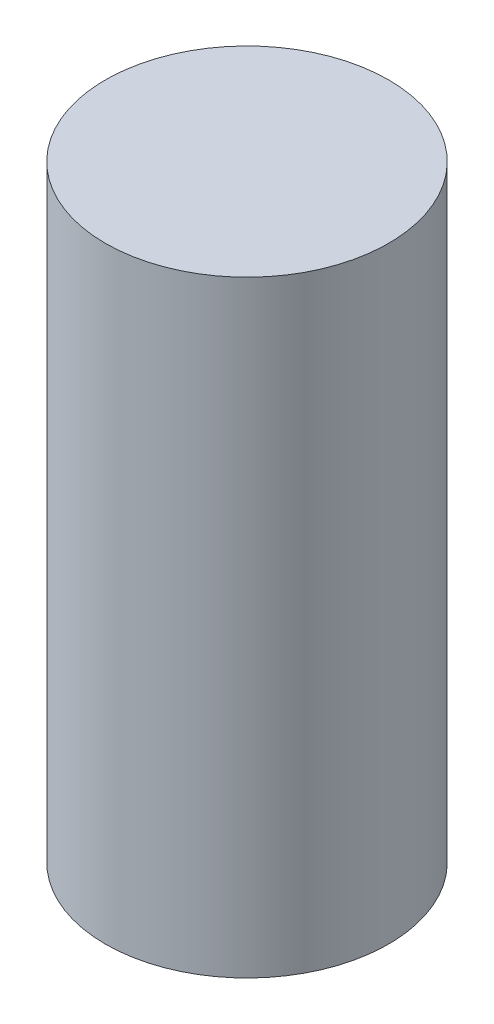
ISO-10303-21;
HEADER;
FILE_DESCRIPTION(('STEP AP214'),'2;1');
FILE_NAME('part.step','',(''),(''),'','','');
FILE_SCHEMA(('AUTOMOTIVE_DESIGN { 1 0 10303 214 1 1 1 1 }'));
ENDSEC;
DATA;
#1=APPLICATION_CONTEXT('core data for automotive mechanical design processes');
#2=APPLICATION_PROTOCOL_DEFINITION('international standard','automotive_design',2000,#1);
#3=PRODUCT_CONTEXT('',#1,'mechanical');
#4=PRODUCT('Part','Part','',(#3));
#5=PRODUCT_RELATED_PRODUCT_CATEGORY('part','',(#4));
#6=PRODUCT_DEFINITION_FORMATION('','',#4);
#7=PRODUCT_DEFINITION_CONTEXT('part definition',#1,'design');
#8=PRODUCT_DEFINITION('design','',#6,#7);
#9=PRODUCT_DEFINITION_SHAPE('','',#8);
#10=(LENGTH_UNIT() NAMED_UNIT(*) SI_UNIT(.MILLI.,.METRE.));
#11=(NAMED_UNIT(*) PLANE_ANGLE_UNIT() SI_UNIT($,.RADIAN.));
#12=(NAMED_UNIT(*) SI_UNIT($,.STERADIAN.) SOLID_ANGLE_UNIT());
#13=UNCERTAINTY_MEASURE_WITH_UNIT(LENGTH_MEASURE(1.E-05),#10,'distance_accuracy_value','');
#14=(GEOMETRIC_REPRESENTATION_CONTEXT(3) GLOBAL_UNCERTAINTY_ASSIGNED_CONTEXT((#13)) GLOBAL_UNIT_ASSIGNED_CONTEXT((#10,
#11,#12)) REPRESENTATION_CONTEXT('',''));
#15=CARTESIAN_POINT('',(0.,0.,0.));
#16=DIRECTION('',(0.,0.,1.));
#17=DIRECTION('',(1.,0.,0.));
#18=AXIS2_PLACEMENT_3D('',#15,#16,#17);
#19=CARTESIAN_POINT('',(0.,15.,0.));
#20=DIRECTION('',(0.,-1.,0.));
#21=DIRECTION('',(0.,0.,-1.));
#22=AXIS2_PLACEMENT_3D('',#19,#20,#21);
#23=CYLINDRICAL_SURFACE('',#22,3.5);
#24=CARTESIAN_POINT('',(0.,15.,0.));
#25=DIRECTION('',(0.,1.,0.));
#26=DIRECTION('',(0.,0.,1.));
#27=AXIS2_PLACEMENT_3D('',#24,#25,#26);
#28=CIRCLE('',#27,3.5);
#29=CARTESIAN_POINT('',(0.,15.,3.5));
#30=VERTEX_POINT('',#29);
#31=EDGE_CURVE('E10',#30,#30,#28,.T.);
#32=ORIENTED_EDGE('',*,*,#31,.F.);
#33=EDGE_LOOP('',(#32));
#34=FACE_BOUND('',#33,.T.);
#35=CARTESIAN_POINT('',(0.,0.,0.));
#36=DIRECTION('',(0.,1.,0.));
#37=DIRECTION('',(0.,0.,1.));
#38=AXIS2_PLACEMENT_3D('',#35,#36,#37);
#39=CIRCLE('',#38,3.5);
#40=CARTESIAN_POINT('',(0.,0.,3.5));
#41=VERTEX_POINT('',#40);
#42=EDGE_CURVE('E34',#41,#41,#39,.T.);
#43=ORIENTED_EDGE('',*,*,#42,.T.);
#44=EDGE_LOOP('',(#43));
#45=FACE_BOUND('',#44,.T.);
#46=ADVANCED_FACE('F31',(#34,#45),#23,.T.);
#47=CARTESIAN_POINT('',(0.,15.,0.));
#48=DIRECTION('',(0.,1.,0.));
#49=DIRECTION('',(0.,0.,1.));
#50=AXIS2_PLACEMENT_3D('',#47,#48,#49);
#51=PLANE('',#50);
#52=ORIENTED_EDGE('',*,*,#31,.T.);
#53=EDGE_LOOP('',(#52));
#54=FACE_BOUND('',#53,.T.);
#55=ADVANCED_FACE('F46',(#54),#51,.T.);
#56=CARTESIAN_POINT('',(0.,0.,0.));
#57=DIRECTION('',(0.,1.,0.));
#58=DIRECTION('',(0.,0.,1.));
#59=AXIS2_PLACEMENT_3D('',#56,#57,#58);
#60=PLANE('',#59);
#61=ORIENTED_EDGE('',*,*,#42,.F.);
#62=EDGE_LOOP('',(#61));
#63=FACE_BOUND('',#62,.T.);
#64=ADVANCED_FACE('F44',(#63),#60,.F.);
#65=CLOSED_SHELL('',(#46,#55,#64));
#66=MANIFOLD_SOLID_BREP('B2',#65);
#67=ADVANCED_BREP_SHAPE_REPRESENTATION('',(#18,#66),#14);
#68=SHAPE_DEFINITION_REPRESENTATION(#9,#67);
ENDSEC;
END-ISO-10303-21;
